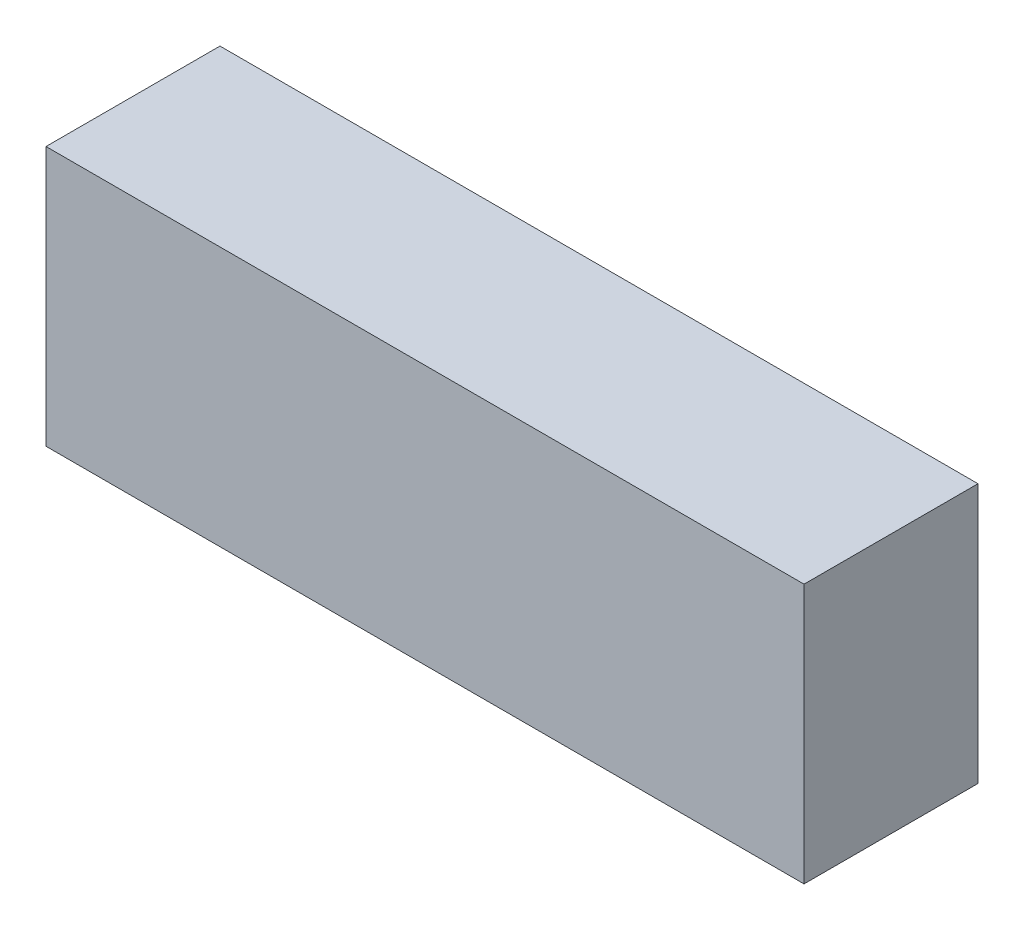
ISO-10303-21;
HEADER;
FILE_DESCRIPTION(('STEP AP214'),'2;1');
FILE_NAME('part.step','',(''),(''),'','','');
FILE_SCHEMA(('AUTOMOTIVE_DESIGN { 1 0 10303 214 1 1 1 1 }'));
ENDSEC;
DATA;
#1=APPLICATION_CONTEXT('core data for automotive mechanical design processes');
#2=APPLICATION_PROTOCOL_DEFINITION('international standard','automotive_design',2000,#1);
#3=PRODUCT_CONTEXT('',#1,'mechanical');
#4=PRODUCT('Part','Part','',(#3));
#5=PRODUCT_RELATED_PRODUCT_CATEGORY('part','',(#4));
#6=PRODUCT_DEFINITION_FORMATION('','',#4);
#7=PRODUCT_DEFINITION_CONTEXT('part definition',#1,'design');
#8=PRODUCT_DEFINITION('design','',#6,#7);
#9=PRODUCT_DEFINITION_SHAPE('','',#8);
#10=(LENGTH_UNIT() NAMED_UNIT(*) SI_UNIT(.MILLI.,.METRE.));
#11=(NAMED_UNIT(*) PLANE_ANGLE_UNIT() SI_UNIT($,.RADIAN.));
#12=(NAMED_UNIT(*) SI_UNIT($,.STERADIAN.) SOLID_ANGLE_UNIT());
#13=UNCERTAINTY_MEASURE_WITH_UNIT(LENGTH_MEASURE(1.E-05),#10,'distance_accuracy_value','');
#14=(GEOMETRIC_REPRESENTATION_CONTEXT(3) GLOBAL_UNCERTAINTY_ASSIGNED_CONTEXT((#13)) GLOBAL_UNIT_ASSIGNED_CONTEXT((#10,
#11,#12)) REPRESENTATION_CONTEXT('',''));
#15=CARTESIAN_POINT('',(0.,0.,0.));
#16=DIRECTION('',(0.,0.,1.));
#17=DIRECTION('',(1.,0.,0.));
#18=AXIS2_PLACEMENT_3D('',#15,#16,#17);
#19=CARTESIAN_POINT('',(10.00000032,3.4249995,4.59000098));
#20=DIRECTION('',(0.,0.,-1.));
#21=DIRECTION('',(0.,-1.,0.));
#22=AXIS2_PLACEMENT_3D('',#19,#20,#21);
#23=PLANE('',#22);
#24=DIRECTION('',(-1.,0.,0.));
#25=VECTOR('',#24,1.);
#26=CARTESIAN_POINT('',(10.00000032,3.4249995,4.59000098));
#27=LINE('',#26,#25);
#28=CARTESIAN_POINT('',(10.00000032,3.4249995,4.59000098));
#29=VERTEX_POINT('',#28);
#30=CARTESIAN_POINT('',(-10.00000032,3.4249995,4.59000098));
#31=VERTEX_POINT('',#30);
#32=EDGE_CURVE('E93',#29,#31,#27,.T.);
#33=ORIENTED_EDGE('',*,*,#32,.T.);
#34=DIRECTION('',(0.,-1.,0.));
#35=VECTOR('',#34,1.);
#36=CARTESIAN_POINT('',(-10.00000032,3.4249995,4.59000098));
#37=LINE('',#36,#35);
#38=CARTESIAN_POINT('',(-10.00000032,-3.4249995,4.59000098));
#39=VERTEX_POINT('',#38);
#40=EDGE_CURVE('E72',#31,#39,#37,.T.);
#41=ORIENTED_EDGE('',*,*,#40,.T.);
#42=DIRECTION('',(1.,0.,0.));
#43=VECTOR('',#42,1.);
#44=CARTESIAN_POINT('',(-10.00000032,-3.4249995,4.59000098));
#45=LINE('',#44,#43);
#46=CARTESIAN_POINT('',(10.00000032,-3.4249995,4.59000098));
#47=VERTEX_POINT('',#46);
#48=EDGE_CURVE('E77',#39,#47,#45,.T.);
#49=ORIENTED_EDGE('',*,*,#48,.T.);
#50=DIRECTION('',(0.,1.,0.));
#51=VECTOR('',#50,1.);
#52=CARTESIAN_POINT('',(10.00000032,-3.4249995,4.59000098));
#53=LINE('',#52,#51);
#54=EDGE_CURVE('E11',#47,#29,#53,.T.);
#55=ORIENTED_EDGE('',*,*,#54,.T.);
#56=EDGE_LOOP('',(#33,#41,#49,#55));
#57=FACE_BOUND('',#56,.T.);
#58=ADVANCED_FACE('F16',(#57),#23,.F.);
#59=CARTESIAN_POINT('',(10.00000032,3.4249995,0.));
#60=DIRECTION('',(0.,0.,-1.));
#61=DIRECTION('',(0.,-1.,0.));
#62=AXIS2_PLACEMENT_3D('',#59,#60,#61);
#63=PLANE('',#62);
#64=DIRECTION('',(0.,1.,0.));
#65=VECTOR('',#64,1.);
#66=CARTESIAN_POINT('',(10.00000032,-3.4249995,0.));
#67=LINE('',#66,#65);
#68=CARTESIAN_POINT('',(10.00000032,-3.4249995,0.));
#69=VERTEX_POINT('',#68);
#70=CARTESIAN_POINT('',(10.00000032,3.4249995,0.));
#71=VERTEX_POINT('',#70);
#72=EDGE_CURVE('E27',#69,#71,#67,.T.);
#73=ORIENTED_EDGE('',*,*,#72,.F.);
#74=DIRECTION('',(1.,0.,0.));
#75=VECTOR('',#74,1.);
#76=CARTESIAN_POINT('',(-10.00000032,-3.4249995,0.));
#77=LINE('',#76,#75);
#78=CARTESIAN_POINT('',(-10.00000032,-3.4249995,0.));
#79=VERTEX_POINT('',#78);
#80=EDGE_CURVE('E62',#79,#69,#77,.T.);
#81=ORIENTED_EDGE('',*,*,#80,.F.);
#82=DIRECTION('',(0.,-1.,0.));
#83=VECTOR('',#82,1.);
#84=CARTESIAN_POINT('',(-10.00000032,3.4249995,0.));
#85=LINE('',#84,#83);
#86=CARTESIAN_POINT('',(-10.00000032,3.4249995,0.));
#87=VERTEX_POINT('',#86);
#88=EDGE_CURVE('E20',#87,#79,#85,.T.);
#89=ORIENTED_EDGE('',*,*,#88,.F.);
#90=DIRECTION('',(-1.,0.,0.));
#91=VECTOR('',#90,1.);
#92=CARTESIAN_POINT('',(10.00000032,3.4249995,0.));
#93=LINE('',#92,#91);
#94=EDGE_CURVE('E102',#71,#87,#93,.T.);
#95=ORIENTED_EDGE('',*,*,#94,.F.);
#96=EDGE_LOOP('',(#73,#81,#89,#95));
#97=FACE_BOUND('',#96,.T.);
#98=ADVANCED_FACE('F18',(#97),#63,.T.);
#99=CARTESIAN_POINT('',(10.00000032,-3.4249995,0.));
#100=DIRECTION('',(-1.,0.,0.));
#101=DIRECTION('',(0.,0.,1.));
#102=AXIS2_PLACEMENT_3D('',#99,#100,#101);
#103=PLANE('',#102);
#104=ORIENTED_EDGE('',*,*,#72,.T.);
#105=DIRECTION('',(0.,0.,1.));
#106=VECTOR('',#105,1.);
#107=CARTESIAN_POINT('',(10.00000032,3.4249995,0.));
#108=LINE('',#107,#106);
#109=EDGE_CURVE('E88',#71,#29,#108,.T.);
#110=ORIENTED_EDGE('',*,*,#109,.T.);
#111=ORIENTED_EDGE('',*,*,#54,.F.);
#112=DIRECTION('',(0.,0.,1.));
#113=VECTOR('',#112,1.);
#114=CARTESIAN_POINT('',(10.00000032,-3.4249995,0.));
#115=LINE('',#114,#113);
#116=EDGE_CURVE('E71',#69,#47,#115,.T.);
#117=ORIENTED_EDGE('',*,*,#116,.F.);
#118=EDGE_LOOP('',(#104,#110,#111,#117));
#119=FACE_BOUND('',#118,.T.);
#120=ADVANCED_FACE('F117',(#119),#103,.F.);
#121=CARTESIAN_POINT('',(-10.00000032,-3.4249995,0.));
#122=DIRECTION('',(0.,1.,0.));
#123=DIRECTION('',(1.,0.,0.));
#124=AXIS2_PLACEMENT_3D('',#121,#122,#123);
#125=PLANE('',#124);
#126=ORIENTED_EDGE('',*,*,#80,.T.);
#127=ORIENTED_EDGE('',*,*,#116,.T.);
#128=ORIENTED_EDGE('',*,*,#48,.F.);
#129=DIRECTION('',(0.,0.,1.));
#130=VECTOR('',#129,1.);
#131=CARTESIAN_POINT('',(-10.00000032,-3.4249995,0.));
#132=LINE('',#131,#130);
#133=EDGE_CURVE('E75',#79,#39,#132,.T.);
#134=ORIENTED_EDGE('',*,*,#133,.F.);
#135=EDGE_LOOP('',(#126,#127,#128,#134));
#136=FACE_BOUND('',#135,.T.);
#137=ADVANCED_FACE('F76',(#136),#125,.F.);
#138=CARTESIAN_POINT('',(-10.00000032,3.4249995,0.));
#139=DIRECTION('',(1.,0.,0.));
#140=DIRECTION('',(0.,1.,0.));
#141=AXIS2_PLACEMENT_3D('',#138,#139,#140);
#142=PLANE('',#141);
#143=ORIENTED_EDGE('',*,*,#88,.T.);
#144=ORIENTED_EDGE('',*,*,#133,.T.);
#145=ORIENTED_EDGE('',*,*,#40,.F.);
#146=DIRECTION('',(0.,0.,1.));
#147=VECTOR('',#146,1.);
#148=CARTESIAN_POINT('',(-10.00000032,3.4249995,0.));
#149=LINE('',#148,#147);
#150=EDGE_CURVE('E85',#87,#31,#149,.T.);
#151=ORIENTED_EDGE('',*,*,#150,.F.);
#152=EDGE_LOOP('',(#143,#144,#145,#151));
#153=FACE_BOUND('',#152,.T.);
#154=ADVANCED_FACE('F83',(#153),#142,.F.);
#155=CARTESIAN_POINT('',(10.00000032,3.4249995,0.));
#156=DIRECTION('',(0.,-1.,0.));
#157=DIRECTION('',(0.,0.,-1.));
#158=AXIS2_PLACEMENT_3D('',#155,#156,#157);
#159=PLANE('',#158);
#160=ORIENTED_EDGE('',*,*,#94,.T.);
#161=ORIENTED_EDGE('',*,*,#150,.T.);
#162=ORIENTED_EDGE('',*,*,#32,.F.);
#163=ORIENTED_EDGE('',*,*,#109,.F.);
#164=EDGE_LOOP('',(#160,#161,#162,#163));
#165=FACE_BOUND('',#164,.T.);
#166=ADVANCED_FACE('F120',(#165),#159,.F.);
#167=CLOSED_SHELL('',(#58,#98,#120,#137,#154,#166));
#168=MANIFOLD_SOLID_BREP('B1',#167);
#169=ADVANCED_BREP_SHAPE_REPRESENTATION('',(#18,#168),#14);
#170=SHAPE_DEFINITION_REPRESENTATION(#9,#169);
ENDSEC;
END-ISO-10303-21;
